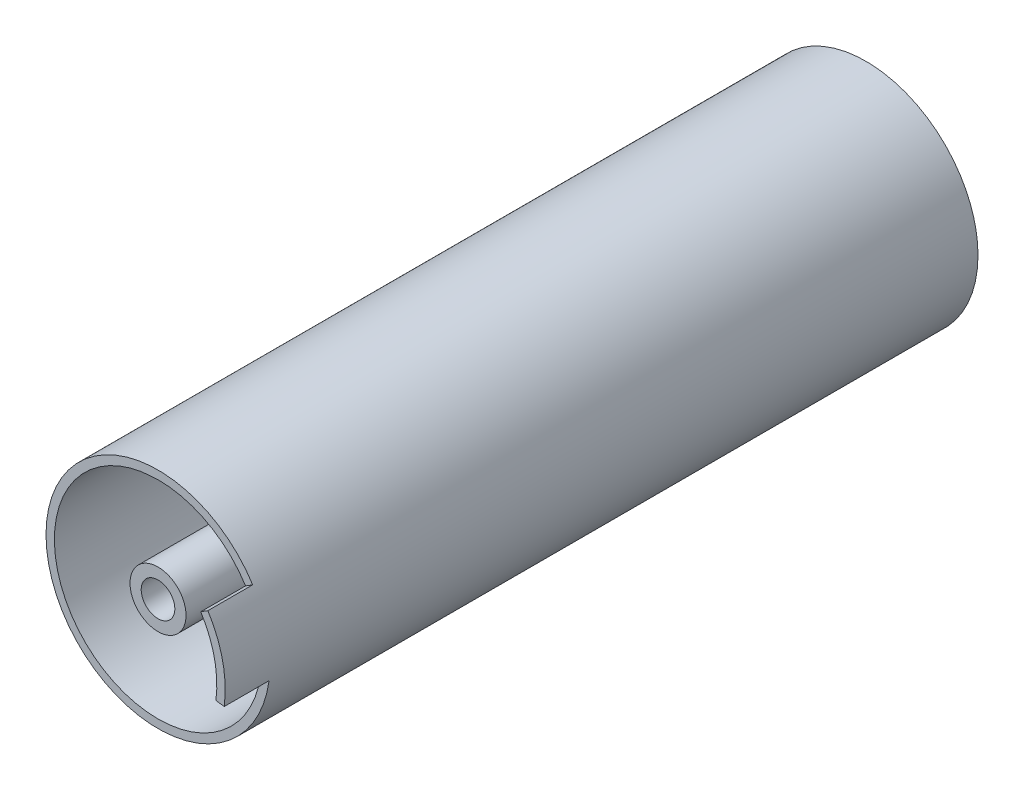
ISO-10303-21;
HEADER;
FILE_DESCRIPTION(('STEP AP214'),'2;1');
FILE_NAME('part.step','',(''),(''),'','','');
FILE_SCHEMA(('AUTOMOTIVE_DESIGN { 1 0 10303 214 1 1 1 1 }'));
ENDSEC;
DATA;
#1=APPLICATION_CONTEXT('core data for automotive mechanical design processes');
#2=APPLICATION_PROTOCOL_DEFINITION('international standard','automotive_design',2000,#1);
#3=PRODUCT_CONTEXT('',#1,'mechanical');
#4=PRODUCT('Part','Part','',(#3));
#5=PRODUCT_RELATED_PRODUCT_CATEGORY('part','',(#4));
#6=PRODUCT_DEFINITION_FORMATION('','',#4);
#7=PRODUCT_DEFINITION_CONTEXT('part definition',#1,'design');
#8=PRODUCT_DEFINITION('design','',#6,#7);
#9=PRODUCT_DEFINITION_SHAPE('','',#8);
#10=(LENGTH_UNIT() NAMED_UNIT(*) SI_UNIT(.MILLI.,.METRE.));
#11=(NAMED_UNIT(*) PLANE_ANGLE_UNIT() SI_UNIT($,.RADIAN.));
#12=(NAMED_UNIT(*) SI_UNIT($,.STERADIAN.) SOLID_ANGLE_UNIT());
#13=UNCERTAINTY_MEASURE_WITH_UNIT(LENGTH_MEASURE(1.E-05),#10,'distance_accuracy_value','');
#14=(GEOMETRIC_REPRESENTATION_CONTEXT(3) GLOBAL_UNCERTAINTY_ASSIGNED_CONTEXT((#13)) GLOBAL_UNIT_ASSIGNED_CONTEXT((#10,
#11,#12)) REPRESENTATION_CONTEXT('',''));
#15=CARTESIAN_POINT('',(0.,0.,0.));
#16=DIRECTION('',(0.,0.,1.));
#17=DIRECTION('',(1.,0.,0.));
#18=AXIS2_PLACEMENT_3D('',#15,#16,#17);
#19=CARTESIAN_POINT('',(0.,0.,53.257864376273));
#20=DIRECTION('',(0.,0.,1.));
#21=DIRECTION('',(1.,0.,0.));
#22=AXIS2_PLACEMENT_3D('',#19,#20,#21);
#23=CYLINDRICAL_SURFACE('',#22,4.99999999999862);
#24=CARTESIAN_POINT('',(0.,0.,126.4));
#25=DIRECTION('',(0.,0.,1.));
#26=DIRECTION('',(1.,0.,0.));
#27=AXIS2_PLACEMENT_3D('',#24,#25,#26);
#28=CIRCLE('',#27,4.99999999999862);
#29=CARTESIAN_POINT('',(4.99999999999862,0.,126.4));
#30=VERTEX_POINT('',#29);
#31=EDGE_CURVE('E56',#30,#30,#28,.T.);
#32=ORIENTED_EDGE('',*,*,#31,.F.);
#33=EDGE_LOOP('',(#32));
#34=FACE_BOUND('',#33,.T.);
#35=CARTESIAN_POINT('',(0.,0.,67.8));
#36=DIRECTION('',(0.,0.,-1.));
#37=DIRECTION('',(-1.,0.,0.));
#38=AXIS2_PLACEMENT_3D('',#35,#36,#37);
#39=CIRCLE('',#38,4.99999999999862);
#40=CARTESIAN_POINT('',(-4.99999999999862,0.,67.8));
#41=VERTEX_POINT('',#40);
#42=EDGE_CURVE('E52',#41,#41,#39,.F.);
#43=ORIENTED_EDGE('',*,*,#42,.T.);
#44=EDGE_LOOP('',(#43));
#45=FACE_BOUND('',#44,.T.);
#46=ADVANCED_FACE('F48',(#34,#45),#23,.T.);
#47=CARTESIAN_POINT('',(0.,0.,53.257864376273));
#48=DIRECTION('',(0.,0.,1.));
#49=DIRECTION('',(1.,0.,0.));
#50=AXIS2_PLACEMENT_3D('',#47,#48,#49);
#51=CYLINDRICAL_SURFACE('',#50,2.99999999999862);
#52=CARTESIAN_POINT('',(0.,0.,126.4));
#53=DIRECTION('',(0.,0.,1.));
#54=DIRECTION('',(1.,0.,0.));
#55=AXIS2_PLACEMENT_3D('',#52,#53,#54);
#56=CIRCLE('',#55,2.99999999999862);
#57=CARTESIAN_POINT('',(2.99999999999862,0.,126.4));
#58=VERTEX_POINT('',#57);
#59=EDGE_CURVE('E60',#58,#58,#56,.T.);
#60=ORIENTED_EDGE('',*,*,#59,.T.);
#61=EDGE_LOOP('',(#60));
#62=FACE_BOUND('',#61,.T.);
#63=CARTESIAN_POINT('',(0.,0.,67.8));
#64=DIRECTION('',(0.,0.,-1.));
#65=DIRECTION('',(-1.,0.,0.));
#66=AXIS2_PLACEMENT_3D('',#63,#64,#65);
#67=CIRCLE('',#66,2.99999999999862);
#68=CARTESIAN_POINT('',(-2.99999999999862,0.,67.8));
#69=VERTEX_POINT('',#68);
#70=EDGE_CURVE('E12',#69,#69,#67,.F.);
#71=ORIENTED_EDGE('',*,*,#70,.F.);
#72=EDGE_LOOP('',(#71));
#73=FACE_BOUND('',#72,.T.);
#74=ADVANCED_FACE('F75',(#62,#73),#51,.F.);
#75=CARTESIAN_POINT('',(0.,0.,126.4));
#76=DIRECTION('',(0.,0.,1.));
#77=DIRECTION('',(1.,0.,0.));
#78=AXIS2_PLACEMENT_3D('',#75,#76,#77);
#79=PLANE('',#78);
#80=ORIENTED_EDGE('',*,*,#59,.F.);
#81=EDGE_LOOP('',(#80));
#82=FACE_BOUND('',#81,.T.);
#83=ORIENTED_EDGE('',*,*,#31,.T.);
#84=EDGE_LOOP('',(#83));
#85=FACE_BOUND('',#84,.T.);
#86=ADVANCED_FACE('F71',(#82,#85),#79,.T.);
#87=CARTESIAN_POINT('',(2.05508176448488E-07,-2.52625562309483E-06,67.8));
#88=DIRECTION('',(0.,0.,-1.));
#89=DIRECTION('',(-1.,0.,0.));
#90=AXIS2_PLACEMENT_3D('',#87,#88,#89);
#91=PLANE('',#90);
#92=ORIENTED_EDGE('',*,*,#42,.F.);
#93=EDGE_LOOP('',(#92));
#94=FACE_BOUND('',#93,.T.);
#95=ORIENTED_EDGE('',*,*,#70,.T.);
#96=EDGE_LOOP('',(#95));
#97=FACE_BOUND('',#96,.T.);
#98=ADVANCED_FACE('F50',(#94,#97),#91,.T.);
#99=CLOSED_SHELL('',(#46,#74,#86,#98));
#100=MANIFOLD_SOLID_BREP('B2',#99);
#101=CARTESIAN_POINT('',(-7.41124908692476,8.1285538056629,126.4));
#102=DIRECTION('',(0.,0.,-1.));
#103=DIRECTION('',(-1.,0.,0.));
#104=AXIS2_PLACEMENT_3D('',#101,#102,#103);
#105=CYLINDRICAL_SURFACE('',#104,6.);
#106=CARTESIAN_POINT('',(-7.41124908692476,8.1285538056629,67.4));
#107=DIRECTION('',(0.,0.,-1.));
#108=DIRECTION('',(-1.,0.,0.));
#109=AXIS2_PLACEMENT_3D('',#106,#107,#108);
#110=CIRCLE('',#109,6.);
#111=CARTESIAN_POINT('',(-1.49013878743609,9.09832327377844,67.4));
#112=VERTEX_POINT('',#111);
#113=CARTESIAN_POINT('',(-3.3687495849658,3.69479718439223,67.4));
#114=VERTEX_POINT('',#113);
#115=EDGE_CURVE('E234',#112,#114,#110,.T.);
#116=ORIENTED_EDGE('',*,*,#115,.F.);
#117=DIRECTION('',(0.,0.,-1.));
#118=VECTOR('',#117,1.);
#119=CARTESIAN_POINT('',(-1.49013878743609,9.09832327377844,126.4));
#120=LINE('',#119,#118);
#121=CARTESIAN_POINT('',(-1.49013878743609,9.09832327377844,59.));
#122=VERTEX_POINT('',#121);
#123=EDGE_CURVE('E267',#112,#122,#120,.T.);
#124=ORIENTED_EDGE('',*,*,#123,.T.);
#125=CARTESIAN_POINT('',(-7.41124908692476,8.1285538056629,59.));
#126=DIRECTION('',(0.,0.,-1.));
#127=DIRECTION('',(-1.,0.,0.));
#128=AXIS2_PLACEMENT_3D('',#125,#126,#127);
#129=CIRCLE('',#128,6.);
#130=CARTESIAN_POINT('',(-3.3687495849658,3.69479718439223,59.));
#131=VERTEX_POINT('',#130);
#132=EDGE_CURVE('E255',#122,#131,#129,.T.);
#133=ORIENTED_EDGE('',*,*,#132,.T.);
#134=DIRECTION('',(0.,0.,-1.));
#135=VECTOR('',#134,1.);
#136=CARTESIAN_POINT('',(-3.3687495849658,3.69479718439223,126.4));
#137=LINE('',#136,#135);
#138=EDGE_CURVE('E268',#114,#131,#137,.T.);
#139=ORIENTED_EDGE('',*,*,#138,.F.);
#140=EDGE_LOOP('',(#116,#124,#133,#139));
#141=FACE_BOUND('',#140,.T.);
#142=ADVANCED_FACE('F110',(#141),#105,.F.);
#143=CARTESIAN_POINT('',(0.,0.,126.4));
#144=DIRECTION('',(0.,0.,-1.));
#145=DIRECTION('',(-1.,0.,0.));
#146=AXIS2_PLACEMENT_3D('',#143,#144,#145);
#147=CYLINDRICAL_SURFACE('',#146,5.);
#148=CARTESIAN_POINT('',(0.,0.,67.4));
#149=DIRECTION('',(0.,0.,-1.));
#150=DIRECTION('',(-1.,0.,0.));
#151=AXIS2_PLACEMENT_3D('',#148,#149,#150);
#152=CIRCLE('',#151,5.);
#153=CARTESIAN_POINT('',(2.72727272727273,4.19070202604222,67.4));
#154=VERTEX_POINT('',#153);
#155=EDGE_CURVE('E236',#114,#154,#152,.F.);
#156=ORIENTED_EDGE('',*,*,#155,.F.);
#157=ORIENTED_EDGE('',*,*,#138,.T.);
#158=CARTESIAN_POINT('',(0.,0.,59.));
#159=DIRECTION('',(0.,0.,-1.));
#160=DIRECTION('',(-1.,0.,0.));
#161=AXIS2_PLACEMENT_3D('',#158,#159,#160);
#162=CIRCLE('',#161,5.);
#163=CARTESIAN_POINT('',(2.72727272727273,4.19070202604222,59.));
#164=VERTEX_POINT('',#163);
#165=EDGE_CURVE('E258',#131,#164,#162,.F.);
#166=ORIENTED_EDGE('',*,*,#165,.T.);
#167=DIRECTION('',(0.,0.,-1.));
#168=VECTOR('',#167,1.);
#169=CARTESIAN_POINT('',(2.72727272727273,4.19070202604222,126.4));
#170=LINE('',#169,#168);
#171=EDGE_CURVE('E271',#154,#164,#170,.T.);
#172=ORIENTED_EDGE('',*,*,#171,.F.);
#173=EDGE_LOOP('',(#156,#157,#166,#172));
#174=FACE_BOUND('',#173,.T.);
#175=ADVANCED_FACE('F324',(#174),#147,.T.);
#176=CARTESIAN_POINT('',(6.,9.21954445729289,126.4));
#177=DIRECTION('',(0.,0.,-1.));
#178=DIRECTION('',(-1.,0.,0.));
#179=AXIS2_PLACEMENT_3D('',#176,#177,#178);
#180=CYLINDRICAL_SURFACE('',#179,6.);
#181=CARTESIAN_POINT('',(6.,9.21954445729289,67.4));
#182=DIRECTION('',(0.,0.,-1.));
#183=DIRECTION('',(-1.,0.,0.));
#184=AXIS2_PLACEMENT_3D('',#181,#182,#183);
#185=CIRCLE('',#184,6.);
#186=CARTESIAN_POINT('',(0.,9.21954445729289,67.4));
#187=VERTEX_POINT('',#186);
#188=EDGE_CURVE('E238',#154,#187,#185,.T.);
#189=ORIENTED_EDGE('',*,*,#188,.F.);
#190=ORIENTED_EDGE('',*,*,#171,.T.);
#191=CARTESIAN_POINT('',(6.,9.21954445729289,59.));
#192=DIRECTION('',(0.,0.,-1.));
#193=DIRECTION('',(-1.,0.,0.));
#194=AXIS2_PLACEMENT_3D('',#191,#192,#193);
#195=CIRCLE('',#194,6.);
#196=CARTESIAN_POINT('',(0.,9.21954445729289,59.));
#197=VERTEX_POINT('',#196);
#198=EDGE_CURVE('E261',#164,#197,#195,.T.);
#199=ORIENTED_EDGE('',*,*,#198,.T.);
#200=DIRECTION('',(0.,0.,-1.));
#201=VECTOR('',#200,1.);
#202=CARTESIAN_POINT('',(0.,9.21954445729289,126.4));
#203=LINE('',#202,#201);
#204=EDGE_CURVE('E273',#187,#197,#203,.T.);
#205=ORIENTED_EDGE('',*,*,#204,.F.);
#206=EDGE_LOOP('',(#189,#190,#199,#205));
#207=FACE_BOUND('',#206,.T.);
#208=ADVANCED_FACE('F319',(#207),#180,.F.);
#209=CARTESIAN_POINT('',(0.,18.5,126.4));
#210=DIRECTION('',(1.,0.,0.));
#211=DIRECTION('',(0.,1.,0.));
#212=AXIS2_PLACEMENT_3D('',#209,#210,#211);
#213=PLANE('',#212);
#214=DIRECTION('',(0.,1.,0.));
#215=VECTOR('',#214,1.);
#216=CARTESIAN_POINT('',(0.,18.5,67.4));
#217=LINE('',#216,#215);
#218=CARTESIAN_POINT('',(0.,18.5,67.4));
#219=VERTEX_POINT('',#218);
#220=EDGE_CURVE('E240',#187,#219,#217,.T.);
#221=ORIENTED_EDGE('',*,*,#220,.F.);
#222=ORIENTED_EDGE('',*,*,#204,.T.);
#223=DIRECTION('',(0.,1.,0.));
#224=VECTOR('',#223,1.);
#225=CARTESIAN_POINT('',(0.,18.5,59.));
#226=LINE('',#225,#224);
#227=CARTESIAN_POINT('',(0.,18.5,59.));
#228=VERTEX_POINT('',#227);
#229=EDGE_CURVE('E264',#197,#228,#226,.T.);
#230=ORIENTED_EDGE('',*,*,#229,.T.);
#231=DIRECTION('',(0.,0.,-1.));
#232=VECTOR('',#231,1.);
#233=CARTESIAN_POINT('',(0.,18.5,126.4));
#234=LINE('',#233,#232);
#235=EDGE_CURVE('E278',#219,#228,#234,.T.);
#236=ORIENTED_EDGE('',*,*,#235,.F.);
#237=EDGE_LOOP('',(#221,#222,#230,#236));
#238=FACE_BOUND('',#237,.T.);
#239=ADVANCED_FACE('F315',(#238),#213,.T.);
#240=CARTESIAN_POINT('',(-2.99012252668958,18.2567567567568,126.4));
#241=DIRECTION('',(-0.986851716581446,-0.161628244685923,0.));
#242=DIRECTION('',(0.161628244685923,-0.986851716581447,0.));
#243=AXIS2_PLACEMENT_3D('',#240,#241,#242);
#244=PLANE('',#243);
#245=DIRECTION('',(0.161628244685923,-0.986851716581447,0.));
#246=VECTOR('',#245,1.);
#247=CARTESIAN_POINT('',(-2.99012252668958,18.2567567567568,67.4));
#248=LINE('',#247,#246);
#249=CARTESIAN_POINT('',(-2.99012252668958,18.2567567567568,67.4));
#250=VERTEX_POINT('',#249);
#251=EDGE_CURVE('E232',#250,#112,#248,.T.);
#252=ORIENTED_EDGE('',*,*,#251,.F.);
#253=DIRECTION('',(0.,0.,-1.));
#254=VECTOR('',#253,1.);
#255=CARTESIAN_POINT('',(-2.99012252668958,18.2567567567568,126.4));
#256=LINE('',#255,#254);
#257=CARTESIAN_POINT('',(-2.99012252668958,18.2567567567568,59.));
#258=VERTEX_POINT('',#257);
#259=EDGE_CURVE('E281',#250,#258,#256,.T.);
#260=ORIENTED_EDGE('',*,*,#259,.T.);
#261=DIRECTION('',(0.161628244685923,-0.986851716581447,0.));
#262=VECTOR('',#261,1.);
#263=CARTESIAN_POINT('',(-2.99012252668958,18.2567567567568,59.));
#264=LINE('',#263,#262);
#265=EDGE_CURVE('E252',#258,#122,#264,.T.);
#266=ORIENTED_EDGE('',*,*,#265,.T.);
#267=ORIENTED_EDGE('',*,*,#123,.F.);
#268=EDGE_LOOP('',(#252,#260,#266,#267));
#269=FACE_BOUND('',#268,.T.);
#270=ADVANCED_FACE('F331',(#269),#244,.T.);
#271=CARTESIAN_POINT('',(0.,0.,126.4));
#272=DIRECTION('',(0.,0.,-1.));
#273=DIRECTION('',(-1.,0.,0.));
#274=AXIS2_PLACEMENT_3D('',#271,#272,#273);
#275=CYLINDRICAL_SURFACE('',#274,3.);
#276=CARTESIAN_POINT('',(0.,0.,67.4));
#277=DIRECTION('',(0.,0.,-1.));
#278=DIRECTION('',(-1.,0.,0.));
#279=AXIS2_PLACEMENT_3D('',#276,#277,#278);
#280=CIRCLE('',#279,3.);
#281=CARTESIAN_POINT('',(-3.,0.,67.4));
#282=VERTEX_POINT('',#281);
#283=EDGE_CURVE('E228',#282,#282,#280,.F.);
#284=ORIENTED_EDGE('',*,*,#283,.T.);
#285=EDGE_LOOP('',(#284));
#286=FACE_BOUND('',#285,.T.);
#287=CARTESIAN_POINT('',(0.,0.,59.));
#288=DIRECTION('',(0.,0.,-1.));
#289=DIRECTION('',(-1.,0.,0.));
#290=AXIS2_PLACEMENT_3D('',#287,#288,#289);
#291=CIRCLE('',#290,3.);
#292=CARTESIAN_POINT('',(-3.,0.,59.));
#293=VERTEX_POINT('',#292);
#294=EDGE_CURVE('E114',#293,#293,#291,.F.);
#295=ORIENTED_EDGE('',*,*,#294,.F.);
#296=EDGE_LOOP('',(#295));
#297=FACE_BOUND('',#296,.T.);
#298=ADVANCED_FACE('F356',(#286,#297),#275,.F.);
#299=CARTESIAN_POINT('',(0.,0.,126.4));
#300=DIRECTION('',(0.,0.,1.));
#301=DIRECTION('',(1.,0.,0.));
#302=AXIS2_PLACEMENT_3D('',#299,#300,#301);
#303=PLANE('',#302);
#304=DIRECTION('',(0.991029909341494,-0.133640258869065,0.));
#305=VECTOR('',#304,1.);
#306=CARTESIAN_POINT('',(19.8205981868299,-2.6728051773813,126.4));
#307=LINE('',#306,#305);
#308=CARTESIAN_POINT('',(18.3340533228176,-2.4723447890777,126.4));
#309=VERTEX_POINT('',#308);
#310=CARTESIAN_POINT('',(19.8205981868299,-2.6728051773813,126.4));
#311=VERTEX_POINT('',#310);
#312=EDGE_CURVE('E216',#309,#311,#307,.T.);
#313=ORIENTED_EDGE('',*,*,#312,.F.);
#314=CARTESIAN_POINT('',(0.,0.,126.4));
#315=DIRECTION('',(0.,0.,1.));
#316=DIRECTION('',(1.,0.,0.));
#317=AXIS2_PLACEMENT_3D('',#314,#315,#316);
#318=CIRCLE('',#317,18.5);
#319=CARTESIAN_POINT('',(-2.99012252668958,18.2567567567568,126.4));
#320=VERTEX_POINT('',#319);
#321=EDGE_CURVE('E283',#320,#309,#318,.T.);
#322=ORIENTED_EDGE('',*,*,#321,.F.);
#323=DIRECTION('',(-0.996707508896528,-0.0810810810810807,0.));
#324=VECTOR('',#323,1.);
#325=CARTESIAN_POINT('',(0.,18.5,126.4));
#326=LINE('',#325,#324);
#327=CARTESIAN_POINT('',(0.,18.5,126.4));
#328=VERTEX_POINT('',#327);
#329=EDGE_CURVE('E219',#328,#320,#326,.T.);
#330=ORIENTED_EDGE('',*,*,#329,.F.);
#331=CARTESIAN_POINT('',(15.6338922650837,9.89097632409239,126.4));
#332=VERTEX_POINT('',#331);
#333=EDGE_CURVE('E286',#332,#328,#318,.T.);
#334=ORIENTED_EDGE('',*,*,#333,.F.);
#335=DIRECTION('',(-0.845075257572092,-0.534647368869859,0.));
#336=VECTOR('',#335,1.);
#337=CARTESIAN_POINT('',(16.9015051514418,10.6929473773972,126.4));
#338=LINE('',#337,#336);
#339=CARTESIAN_POINT('',(16.9015051514418,10.6929473773972,126.4));
#340=VERTEX_POINT('',#339);
#341=EDGE_CURVE('E130',#340,#332,#338,.T.);
#342=ORIENTED_EDGE('',*,*,#341,.F.);
#343=CARTESIAN_POINT('',(0.,0.,126.4));
#344=DIRECTION('',(0.,0.,1.));
#345=DIRECTION('',(1.,0.,0.));
#346=AXIS2_PLACEMENT_3D('',#343,#344,#345);
#347=CIRCLE('',#346,20.);
#348=EDGE_CURVE('E46',#340,#311,#347,.T.);
#349=ORIENTED_EDGE('',*,*,#348,.T.);
#350=EDGE_LOOP('',(#313,#322,#330,#334,#342,#349));
#351=FACE_BOUND('',#350,.T.);
#352=ADVANCED_FACE('F294',(#351),#303,.T.);
#353=CARTESIAN_POINT('',(0.,0.,0.));
#354=DIRECTION('',(0.,0.,1.));
#355=DIRECTION('',(1.,0.,0.));
#356=AXIS2_PLACEMENT_3D('',#353,#354,#355);
#357=PLANE('',#356);
#358=CARTESIAN_POINT('',(0.,0.,0.));
#359=DIRECTION('',(0.,0.,1.));
#360=DIRECTION('',(1.,0.,0.));
#361=AXIS2_PLACEMENT_3D('',#358,#359,#360);
#362=CIRCLE('',#361,20.);
#363=CARTESIAN_POINT('',(20.,0.,0.));
#364=VERTEX_POINT('',#363);
#365=EDGE_CURVE('E119',#364,#364,#362,.T.);
#366=ORIENTED_EDGE('',*,*,#365,.F.);
#367=EDGE_LOOP('',(#366));
#368=FACE_BOUND('',#367,.T.);
#369=CARTESIAN_POINT('',(0.,0.,0.));
#370=DIRECTION('',(0.,0.,1.));
#371=DIRECTION('',(1.,0.,0.));
#372=AXIS2_PLACEMENT_3D('',#369,#370,#371);
#373=CIRCLE('',#372,18.5);
#374=CARTESIAN_POINT('',(-2.99012252668958,18.2567567567568,0.));
#375=VERTEX_POINT('',#374);
#376=CARTESIAN_POINT('',(0.,18.5,0.));
#377=VERTEX_POINT('',#376);
#378=EDGE_CURVE('E270',#375,#377,#373,.T.);
#379=ORIENTED_EDGE('',*,*,#378,.T.);
#380=DIRECTION('',(0.996707508896528,0.0810810810810807,0.));
#381=VECTOR('',#380,1.);
#382=CARTESIAN_POINT('',(0.,18.5,0.));
#383=LINE('',#382,#381);
#384=EDGE_CURVE('E242',#375,#377,#383,.T.);
#385=ORIENTED_EDGE('',*,*,#384,.F.);
#386=EDGE_LOOP('',(#379,#385));
#387=FACE_BOUND('',#386,.T.);
#388=ADVANCED_FACE('F291',(#368,#387),#357,.F.);
#389=CARTESIAN_POINT('',(0.,0.,126.4));
#390=DIRECTION('',(0.,0.,-1.));
#391=DIRECTION('',(-1.,0.,0.));
#392=AXIS2_PLACEMENT_3D('',#389,#390,#391);
#393=CYLINDRICAL_SURFACE('',#392,20.);
#394=ORIENTED_EDGE('',*,*,#348,.F.);
#395=DIRECTION('',(0.,0.,-1.));
#396=VECTOR('',#395,1.);
#397=CARTESIAN_POINT('',(16.9015051514418,10.6929473773972,134.4));
#398=LINE('',#397,#396);
#399=CARTESIAN_POINT('',(16.9015051514418,10.6929473773972,134.4));
#400=VERTEX_POINT('',#399);
#401=EDGE_CURVE('E201',#400,#340,#398,.T.);
#402=ORIENTED_EDGE('',*,*,#401,.F.);
#403=CARTESIAN_POINT('',(0.,0.,134.4));
#404=DIRECTION('',(0.,0.,1.));
#405=DIRECTION('',(-1.,0.,0.));
#406=AXIS2_PLACEMENT_3D('',#403,#404,#405);
#407=CIRCLE('',#406,20.);
#408=CARTESIAN_POINT('',(19.8205981868299,-2.6728051773813,134.4));
#409=VERTEX_POINT('',#408);
#410=EDGE_CURVE('E207',#409,#400,#407,.T.);
#411=ORIENTED_EDGE('',*,*,#410,.F.);
#412=DIRECTION('',(0.,0.,-1.));
#413=VECTOR('',#412,1.);
#414=CARTESIAN_POINT('',(19.8205981868299,-2.6728051773813,134.4));
#415=LINE('',#414,#413);
#416=EDGE_CURVE('E344',#409,#311,#415,.T.);
#417=ORIENTED_EDGE('',*,*,#416,.T.);
#418=EDGE_LOOP('',(#394,#402,#411,#417));
#419=FACE_BOUND('',#418,.T.);
#420=ORIENTED_EDGE('',*,*,#365,.T.);
#421=EDGE_LOOP('',(#420));
#422=FACE_BOUND('',#421,.T.);
#423=ADVANCED_FACE('F112',(#419,#422),#393,.T.);
#424=CARTESIAN_POINT('',(0.,0.,126.4));
#425=DIRECTION('',(0.,0.,-1.));
#426=DIRECTION('',(-1.,0.,0.));
#427=AXIS2_PLACEMENT_3D('',#424,#425,#426);
#428=CYLINDRICAL_SURFACE('',#427,18.5);
#429=ORIENTED_EDGE('',*,*,#259,.F.);
#430=EDGE_CURVE('E279',#320,#250,#256,.T.);
#431=ORIENTED_EDGE('',*,*,#430,.F.);
#432=ORIENTED_EDGE('',*,*,#321,.T.);
#433=DIRECTION('',(0.,0.,-1.));
#434=VECTOR('',#433,1.);
#435=CARTESIAN_POINT('',(18.3340533228176,-2.4723447890777,134.4));
#436=LINE('',#435,#434);
#437=CARTESIAN_POINT('',(18.3340533228176,-2.4723447890777,134.4));
#438=VERTEX_POINT('',#437);
#439=EDGE_CURVE('E223',#438,#309,#436,.T.);
#440=ORIENTED_EDGE('',*,*,#439,.F.);
#441=CARTESIAN_POINT('',(0.,0.,134.4));
#442=DIRECTION('',(0.,0.,-1.));
#443=DIRECTION('',(-1.,0.,0.));
#444=AXIS2_PLACEMENT_3D('',#441,#442,#443);
#445=CIRCLE('',#444,18.5);
#446=CARTESIAN_POINT('',(15.6338922650837,9.89097632409239,134.4));
#447=VERTEX_POINT('',#446);
#448=EDGE_CURVE('E206',#447,#438,#445,.T.);
#449=ORIENTED_EDGE('',*,*,#448,.F.);
#450=DIRECTION('',(0.,0.,-1.));
#451=VECTOR('',#450,1.);
#452=CARTESIAN_POINT('',(15.6338922650837,9.89097632409239,134.4));
#453=LINE('',#452,#451);
#454=EDGE_CURVE('E203',#447,#332,#453,.T.);
#455=ORIENTED_EDGE('',*,*,#454,.T.);
#456=ORIENTED_EDGE('',*,*,#333,.T.);
#457=EDGE_CURVE('E275',#328,#219,#234,.T.);
#458=ORIENTED_EDGE('',*,*,#457,.T.);
#459=ORIENTED_EDGE('',*,*,#235,.T.);
#460=DIRECTION('',(0.,0.,-1.));
#461=VECTOR('',#460,1.);
#462=CARTESIAN_POINT('',(0.,18.5,59.));
#463=LINE('',#462,#461);
#464=EDGE_CURVE('E248',#228,#377,#463,.T.);
#465=ORIENTED_EDGE('',*,*,#464,.T.);
#466=ORIENTED_EDGE('',*,*,#378,.F.);
#467=DIRECTION('',(0.,0.,-1.));
#468=VECTOR('',#467,1.);
#469=CARTESIAN_POINT('',(-2.99012252668958,18.2567567567568,59.));
#470=LINE('',#469,#468);
#471=EDGE_CURVE('E246',#258,#375,#470,.T.);
#472=ORIENTED_EDGE('',*,*,#471,.F.);
#473=EDGE_LOOP('',(#429,#431,#432,#440,#449,#455,#456,#458,#459,#465,#466,#472));
#474=FACE_BOUND('',#473,.T.);
#475=ADVANCED_FACE('F300',(#474),#428,.F.);
#476=CARTESIAN_POINT('',(0.,-5.01335084557297E-13,59.));
#477=DIRECTION('',(0.,0.,-1.));
#478=DIRECTION('',(-1.,0.,0.));
#479=AXIS2_PLACEMENT_3D('',#476,#477,#478);
#480=PLANE('',#479);
#481=ORIENTED_EDGE('',*,*,#198,.F.);
#482=ORIENTED_EDGE('',*,*,#165,.F.);
#483=ORIENTED_EDGE('',*,*,#132,.F.);
#484=ORIENTED_EDGE('',*,*,#265,.F.);
#485=DIRECTION('',(0.996707508896528,0.0810810810810807,0.));
#486=VECTOR('',#485,1.);
#487=CARTESIAN_POINT('',(0.,18.5,59.));
#488=LINE('',#487,#486);
#489=EDGE_CURVE('E243',#258,#228,#488,.T.);
#490=ORIENTED_EDGE('',*,*,#489,.T.);
#491=ORIENTED_EDGE('',*,*,#229,.F.);
#492=EDGE_LOOP('',(#481,#482,#483,#484,#490,#491));
#493=FACE_BOUND('',#492,.T.);
#494=ORIENTED_EDGE('',*,*,#294,.T.);
#495=EDGE_LOOP('',(#494));
#496=FACE_BOUND('',#495,.T.);
#497=ADVANCED_FACE('F310',(#493,#496),#480,.T.);
#498=CARTESIAN_POINT('',(0.,18.5,59.));
#499=DIRECTION('',(-0.0810810810810807,0.996707508896528,0.));
#500=DIRECTION('',(-0.996707508896528,-0.0810810810810807,0.));
#501=AXIS2_PLACEMENT_3D('',#498,#499,#500);
#502=PLANE('',#501);
#503=ORIENTED_EDGE('',*,*,#384,.T.);
#504=ORIENTED_EDGE('',*,*,#464,.F.);
#505=ORIENTED_EDGE('',*,*,#489,.F.);
#506=ORIENTED_EDGE('',*,*,#471,.T.);
#507=EDGE_LOOP('',(#503,#504,#505,#506));
#508=FACE_BOUND('',#507,.T.);
#509=ADVANCED_FACE('F305',(#508),#502,.F.);
#510=CARTESIAN_POINT('',(2.05508176448488E-07,-2.52625562309483E-06,67.4));
#511=DIRECTION('',(0.,0.,-1.));
#512=DIRECTION('',(-1.,0.,0.));
#513=AXIS2_PLACEMENT_3D('',#510,#511,#512);
#514=PLANE('',#513);
#515=ORIENTED_EDGE('',*,*,#220,.T.);
#516=DIRECTION('',(-0.996707508896528,-0.0810810810810807,0.));
#517=VECTOR('',#516,1.);
#518=CARTESIAN_POINT('',(0.,18.5,67.4));
#519=LINE('',#518,#517);
#520=EDGE_CURVE('E221',#219,#250,#519,.T.);
#521=ORIENTED_EDGE('',*,*,#520,.T.);
#522=ORIENTED_EDGE('',*,*,#251,.T.);
#523=ORIENTED_EDGE('',*,*,#115,.T.);
#524=ORIENTED_EDGE('',*,*,#155,.T.);
#525=ORIENTED_EDGE('',*,*,#188,.T.);
#526=EDGE_LOOP('',(#515,#521,#522,#523,#524,#525));
#527=FACE_BOUND('',#526,.T.);
#528=ORIENTED_EDGE('',*,*,#283,.F.);
#529=EDGE_LOOP('',(#528));
#530=FACE_BOUND('',#529,.T.);
#531=ADVANCED_FACE('F350',(#527,#530),#514,.F.);
#532=CARTESIAN_POINT('',(0.,18.5,67.4));
#533=DIRECTION('',(-0.0810810810810807,0.996707508896528,0.));
#534=DIRECTION('',(-0.996707508896528,-0.0810810810810807,0.));
#535=AXIS2_PLACEMENT_3D('',#532,#533,#534);
#536=PLANE('',#535);
#537=ORIENTED_EDGE('',*,*,#329,.T.);
#538=ORIENTED_EDGE('',*,*,#430,.T.);
#539=ORIENTED_EDGE('',*,*,#520,.F.);
#540=ORIENTED_EDGE('',*,*,#457,.F.);
#541=EDGE_LOOP('',(#537,#538,#539,#540));
#542=FACE_BOUND('',#541,.T.);
#543=ADVANCED_FACE('F348',(#542),#536,.F.);
#544=CARTESIAN_POINT('',(16.9015051514418,10.6929473773972,134.4));
#545=DIRECTION('',(0.534647368869858,-0.845075257572092,0.));
#546=DIRECTION('',(0.845075257572092,0.534647368869858,0.));
#547=AXIS2_PLACEMENT_3D('',#544,#545,#546);
#548=PLANE('',#547);
#549=ORIENTED_EDGE('',*,*,#341,.T.);
#550=ORIENTED_EDGE('',*,*,#454,.F.);
#551=DIRECTION('',(-0.845075257572092,-0.534647368869859,0.));
#552=VECTOR('',#551,1.);
#553=CARTESIAN_POINT('',(16.9015051514418,10.6929473773972,134.4));
#554=LINE('',#553,#552);
#555=EDGE_CURVE('E197',#400,#447,#554,.T.);
#556=ORIENTED_EDGE('',*,*,#555,.F.);
#557=ORIENTED_EDGE('',*,*,#401,.T.);
#558=EDGE_LOOP('',(#549,#550,#556,#557));
#559=FACE_BOUND('',#558,.T.);
#560=ADVANCED_FACE('F199',(#559),#548,.F.);
#561=CARTESIAN_POINT('',(19.8205981868299,-2.6728051773813,134.4));
#562=DIRECTION('',(0.133640258869065,0.991029909341494,0.));
#563=DIRECTION('',(-0.991029909341494,0.133640258869065,0.));
#564=AXIS2_PLACEMENT_3D('',#561,#562,#563);
#565=PLANE('',#564);
#566=ORIENTED_EDGE('',*,*,#312,.T.);
#567=ORIENTED_EDGE('',*,*,#416,.F.);
#568=DIRECTION('',(0.991029909341494,-0.133640258869065,0.));
#569=VECTOR('',#568,1.);
#570=CARTESIAN_POINT('',(19.8205981868299,-2.6728051773813,134.4));
#571=LINE('',#570,#569);
#572=EDGE_CURVE('E212',#438,#409,#571,.T.);
#573=ORIENTED_EDGE('',*,*,#572,.F.);
#574=ORIENTED_EDGE('',*,*,#439,.T.);
#575=EDGE_LOOP('',(#566,#567,#573,#574));
#576=FACE_BOUND('',#575,.T.);
#577=ADVANCED_FACE('F345',(#576),#565,.F.);
#578=CARTESIAN_POINT('',(0.,0.,134.4));
#579=DIRECTION('',(0.,0.,-1.));
#580=DIRECTION('',(-1.,0.,0.));
#581=AXIS2_PLACEMENT_3D('',#578,#579,#580);
#582=PLANE('',#581);
#583=ORIENTED_EDGE('',*,*,#410,.T.);
#584=ORIENTED_EDGE('',*,*,#555,.T.);
#585=ORIENTED_EDGE('',*,*,#448,.T.);
#586=ORIENTED_EDGE('',*,*,#572,.T.);
#587=EDGE_LOOP('',(#583,#584,#585,#586));
#588=FACE_BOUND('',#587,.T.);
#589=ADVANCED_FACE('F210',(#588),#582,.F.);
#590=CLOSED_SHELL('',(#142,#175,#208,#239,#270,#298,#352,#388,#423,#475,#497,#509,#531,#543,
#560,#577,#589));
#591=MANIFOLD_SOLID_BREP('B7',#590);
#592=ADVANCED_BREP_SHAPE_REPRESENTATION('',(#18,#100,#591),#14);
#593=SHAPE_DEFINITION_REPRESENTATION(#9,#592);
ENDSEC;
END-ISO-10303-21;
